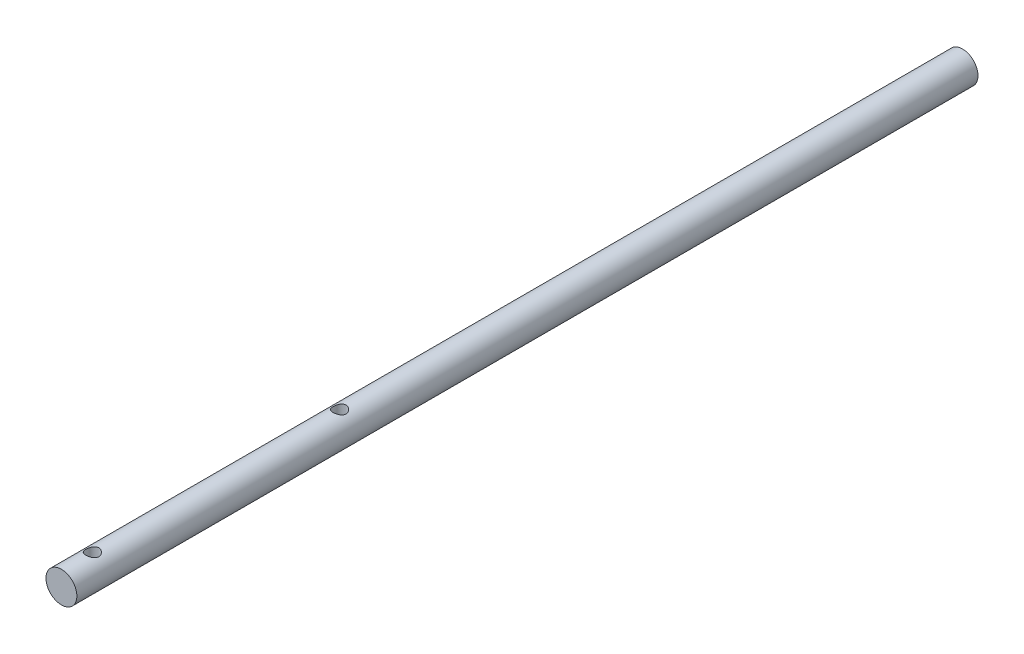
ISO-10303-21;
HEADER;
FILE_DESCRIPTION(('STEP AP214'),'2;1');
FILE_NAME('part.step','',(''),(''),'','','');
FILE_SCHEMA(('AUTOMOTIVE_DESIGN { 1 0 10303 214 1 1 1 1 }'));
ENDSEC;
DATA;
#1=APPLICATION_CONTEXT('core data for automotive mechanical design processes');
#2=APPLICATION_PROTOCOL_DEFINITION('international standard','automotive_design',2000,#1);
#3=PRODUCT_CONTEXT('',#1,'mechanical');
#4=PRODUCT('Part','Part','',(#3));
#5=PRODUCT_RELATED_PRODUCT_CATEGORY('part','',(#4));
#6=PRODUCT_DEFINITION_FORMATION('','',#4);
#7=PRODUCT_DEFINITION_CONTEXT('part definition',#1,'design');
#8=PRODUCT_DEFINITION('design','',#6,#7);
#9=PRODUCT_DEFINITION_SHAPE('','',#8);
#10=(LENGTH_UNIT() NAMED_UNIT(*) SI_UNIT(.MILLI.,.METRE.));
#11=(NAMED_UNIT(*) PLANE_ANGLE_UNIT() SI_UNIT($,.RADIAN.));
#12=(NAMED_UNIT(*) SI_UNIT($,.STERADIAN.) SOLID_ANGLE_UNIT());
#13=UNCERTAINTY_MEASURE_WITH_UNIT(LENGTH_MEASURE(1.E-05),#10,'distance_accuracy_value','');
#14=(GEOMETRIC_REPRESENTATION_CONTEXT(3) GLOBAL_UNCERTAINTY_ASSIGNED_CONTEXT((#13)) GLOBAL_UNIT_ASSIGNED_CONTEXT((#10,
#11,#12)) REPRESENTATION_CONTEXT('',''));
#15=CARTESIAN_POINT('',(0.,0.,0.));
#16=DIRECTION('',(0.,0.,1.));
#17=DIRECTION('',(1.,0.,0.));
#18=AXIS2_PLACEMENT_3D('',#15,#16,#17);
#19=CARTESIAN_POINT('',(0.,0.,175.));
#20=DIRECTION('',(0.,0.,-1.));
#21=DIRECTION('',(-1.,0.,0.));
#22=AXIS2_PLACEMENT_3D('',#19,#20,#21);
#23=CYLINDRICAL_SURFACE('',#22,3.);
#24=CARTESIAN_POINT('',(0.,-3.,170.25));
#25=CARTESIAN_POINT('',(0.0669580526362678,-2.99999458367273,170.249992794909));
#26=CARTESIAN_POINT('',(0.134021397063843,-2.9977323297471,170.244588041472));
#27=CARTESIAN_POINT('',(0.266247371156348,-2.98890153579552,170.22316093508));
#28=CARTESIAN_POINT('',(0.331404576423564,-2.98232175901028,170.207110875536));
#29=CARTESIAN_POINT('',(0.457688733653095,-2.96556289038127,170.165088908219));
#30=CARTESIAN_POINT('',(0.518828524426284,-2.95539599975003,170.139150610532));
#31=CARTESIAN_POINT('',(0.635829756679815,-2.93245286470664,170.078227176767));
#32=CARTESIAN_POINT('',(0.691692790015943,-2.91967741092849,170.043244781029));
#33=CARTESIAN_POINT('',(0.799448403559513,-2.89207828351869,169.963371017409));
#34=CARTESIAN_POINT('',(0.851041267517777,-2.87718753326093,169.91809869121));
#35=CARTESIAN_POINT('',(0.946159821091273,-2.84732714068513,169.819735665217));
#36=CARTESIAN_POINT('',(0.989681263153091,-2.83235746106809,169.766640875105));
#37=CARTESIAN_POINT('',(1.06953737697066,-2.80321021812995,169.650973222435));
#38=CARTESIAN_POINT('',(1.10541308153926,-2.78910786873385,169.588062551573));
#39=CARTESIAN_POINT('',(1.16593940588866,-2.76435572357005,169.456426742079));
#40=CARTESIAN_POINT('',(1.19059580836291,-2.75370415000823,169.387704620516));
#41=CARTESIAN_POINT('',(1.22674598312159,-2.73778555387705,169.249846308232));
#42=CARTESIAN_POINT('',(1.23881657877606,-2.73228387651787,169.180889516608));
#43=CARTESIAN_POINT('',(1.25125209967797,-2.72661326219504,169.041726707313));
#44=CARTESIAN_POINT('',(1.25162348054398,-2.7264413842526,168.971521399974));
#45=CARTESIAN_POINT('',(1.24108450363674,-2.73125119560853,168.837599939565));
#46=CARTESIAN_POINT('',(1.23103681112301,-2.73583882723623,168.773798903436));
#47=CARTESIAN_POINT('',(1.20139191015777,-2.74898482773796,168.648887909));
#48=CARTESIAN_POINT('',(1.18179287287177,-2.75754395703563,168.587778468508));
#49=CARTESIAN_POINT('',(1.13321958727571,-2.77786184772756,168.468442297009));
#50=CARTESIAN_POINT('',(1.10405471539236,-2.78968481949136,168.410304579087));
#51=CARTESIAN_POINT('',(1.03731242580561,-2.81518331141086,168.29952226612));
#52=CARTESIAN_POINT('',(0.999731690519536,-2.8288595612978,168.246879849386));
#53=CARTESIAN_POINT('',(0.91349596554383,-2.85792976877979,168.143900041267));
#54=CARTESIAN_POINT('',(0.864173483207521,-2.87337121404473,168.094133432615));
#55=CARTESIAN_POINT('',(0.757729591051508,-2.90325673112529,168.003386497041));
#56=CARTESIAN_POINT('',(0.700606359448454,-2.9177005687701,167.962408228308));
#57=CARTESIAN_POINT('',(0.578447948693374,-2.94438283556473,167.889564176384));
#58=CARTESIAN_POINT('',(0.513260582447676,-2.95656266543334,167.857930554849));
#59=CARTESIAN_POINT('',(0.377852402526824,-2.97689481414803,167.806278860397));
#60=CARTESIAN_POINT('',(0.307634394795024,-2.985049358458,167.786254368056));
#61=CARTESIAN_POINT('',(0.168928113346216,-2.99599641186385,167.759584007873));
#62=CARTESIAN_POINT('',(0.100611285278629,-2.99909541047125,167.752172142556));
#63=CARTESIAN_POINT('',(-0.0363546554960972,-3.00056050368745,167.748653776386));
#64=CARTESIAN_POINT('',(-0.105003667152643,-2.99892795711939,167.752544029748));
#65=CARTESIAN_POINT('',(-0.23709824234144,-2.9913121765694,167.770971084806));
#66=CARTESIAN_POINT('',(-0.30063296663939,-2.9855488728399,167.784969954097));
#67=CARTESIAN_POINT('',(-0.424382748971094,-2.97048606772414,167.822468194541));
#68=CARTESIAN_POINT('',(-0.484597386518366,-2.96118611959704,167.84596876595));
#69=CARTESIAN_POINT('',(-0.602108999869142,-2.93958270645166,167.902570975712));
#70=CARTESIAN_POINT('',(-0.659257236855328,-2.92719491469281,167.935948183146));
#71=CARTESIAN_POINT('',(-0.767346216231435,-2.9007380457909,168.011053377792));
#72=CARTESIAN_POINT('',(-0.81828435260195,-2.88666826768733,168.052784851529));
#73=CARTESIAN_POINT('',(-0.916333430274275,-2.85712087895437,168.146903233272));
#74=CARTESIAN_POINT('',(-0.962910697979845,-2.84161451591029,168.199838502986));
#75=CARTESIAN_POINT('',(-1.04666984610552,-2.81184336768005,168.313021275935));
#76=CARTESIAN_POINT('',(-1.08384959285618,-2.79757886493438,168.373270435172));
#77=CARTESIAN_POINT('',(-1.148159602087,-2.77181386243988,168.500614175303));
#78=CARTESIAN_POINT('',(-1.1751391823733,-2.76035562555111,168.567794035515));
#79=CARTESIAN_POINT('',(-1.21717413951573,-2.74208355658957,168.70637059381));
#80=CARTESIAN_POINT('',(-1.23223934863688,-2.73526589555752,168.777763762483));
#81=CARTESIAN_POINT('',(-1.24904080348901,-2.72763164537264,168.916818699199));
#82=CARTESIAN_POINT('',(-1.2517138041313,-2.72639350967162,168.984344662293));
#83=CARTESIAN_POINT('',(-1.24615575523912,-2.72893853011024,169.118842861141));
#84=CARTESIAN_POINT('',(-1.23792637964721,-2.73272091540306,169.185815180314));
#85=CARTESIAN_POINT('',(-1.21158404780492,-2.74449551302268,169.314092747469));
#86=CARTESIAN_POINT('',(-1.19394903571467,-2.7522835484648,169.375516673463));
#87=CARTESIAN_POINT('',(-1.14976328202135,-2.77103181199189,169.494548021357));
#88=CARTESIAN_POINT('',(-1.12321003517252,-2.78199293131693,169.552154365399));
#89=CARTESIAN_POINT('',(-1.0601028593549,-2.80666954560013,169.665695895949));
#90=CARTESIAN_POINT('',(-1.02304360910484,-2.82051102713679,169.721322330168));
#91=CARTESIAN_POINT('',(-0.940684072630407,-2.84903689053839,169.825860139361));
#92=CARTESIAN_POINT('',(-0.895380928905638,-2.86372156345874,169.874769175601));
#93=CARTESIAN_POINT('',(-0.793902045778841,-2.89356392850106,169.968148681685));
#94=CARTESIAN_POINT('',(-0.737174739949044,-2.90867817511791,170.012036432841));
#95=CARTESIAN_POINT('',(-0.616600079253208,-2.9366014362202,170.089699453544));
#96=CARTESIAN_POINT('',(-0.552749497945751,-2.9494093991674,170.12347011489));
#97=CARTESIAN_POINT('',(-0.420732056717951,-2.97109183362461,170.17920984544));
#98=CARTESIAN_POINT('',(-0.352653990980636,-2.98002782581964,170.201364766617));
#99=CARTESIAN_POINT('',(-0.21341042184656,-2.99321009768625,170.233706329078));
#100=CARTESIAN_POINT('',(-0.14225531698096,-2.99747105811967,170.24393044253));
#101=CARTESIAN_POINT('',(-0.0472360819191856,-2.99972287568934,170.249333161086));
#102=CARTESIAN_POINT('',(-0.0236245946756582,-3.00000191102536,170.250002542149));
#103=CARTESIAN_POINT('',(0.,-3.,170.25));
#104=B_SPLINE_CURVE_WITH_KNOTS('',3,(#24,#25,#26,#27,#28,#29,#30,#31,#32,#33,#34,#35,#36,#37,
#38,#39,#40,#41,#42,#43,#44,#45,#46,#47,#48,#49,#50,#51,#52,#53,#54,#55,#56,#57,#58,#59,#60,#61,
#62,#63,#64,#65,#66,#67,#68,#69,#70,#71,#72,#73,#74,#75,#76,#77,#78,#79,#80,#81,#82,#83,#84,#85,
#86,#87,#88,#89,#90,#91,#92,#93,#94,#95,#96,#97,#98,#99,#100,#101,#102,#103),.UNSPECIFIED.,.T.,
.F.,(4,2,2,2,2,2,2,2,2,2,2,2,2,2,2,2,2,2,2,2,2,2,2,2,2,2,2,2,2,2,2,2,2,2,2,2,2,2,2,4),(0.,
0.200806918883941,0.402138540628699,0.602791851906322,0.803384436852973,1.01317936288808,
1.22308438131466,1.44331724539126,1.66343646730589,1.87295273137559,2.08235338249048,
2.27570157202556,2.46908679727212,2.66658713058717,2.86416545717208,3.07844141127898,
3.2927674931459,3.51204055060814,3.73119224218299,3.93648443393253,4.14171767493173,
4.33676589735723,4.53183876601786,4.73297135272163,4.93418805469498,5.14978488029297,
5.36543061240344,5.58414788359525,5.8026844707458,6.00439877559647,6.20608211297535,
6.39837649964764,6.59072494950612,6.79463893397442,6.99862373425941,7.21746535004888,
7.43640649428584,7.65172855819387,7.86637250469323,7.937222564991),.UNSPECIFIED.);
#105=CARTESIAN_POINT('',(0.,-3.,170.25));
#106=VERTEX_POINT('',#105);
#107=EDGE_CURVE('E10',#106,#106,#104,.T.);
#108=ORIENTED_EDGE('',*,*,#107,.T.);
#109=EDGE_LOOP('',(#108));
#110=FACE_BOUND('',#109,.T.);
#111=CARTESIAN_POINT('',(0.,3.,170.25));
#112=CARTESIAN_POINT('',(-0.0669580526362678,2.99999458367273,170.249992794909));
#113=CARTESIAN_POINT('',(-0.134021397063843,2.9977323297471,170.244588041472));
#114=CARTESIAN_POINT('',(-0.266247371156348,2.98890153579552,170.22316093508));
#115=CARTESIAN_POINT('',(-0.331404576423564,2.98232175901028,170.207110875536));
#116=CARTESIAN_POINT('',(-0.457688733653095,2.96556289038127,170.165088908219));
#117=CARTESIAN_POINT('',(-0.518828524426284,2.95539599975003,170.139150610532));
#118=CARTESIAN_POINT('',(-0.635829756679816,2.93245286470664,170.078227176767));
#119=CARTESIAN_POINT('',(-0.691692790015945,2.91967741092849,170.043244781029));
#120=CARTESIAN_POINT('',(-0.799448403559509,2.89207828351869,169.963371017409));
#121=CARTESIAN_POINT('',(-0.851041267517766,2.87718753326093,169.91809869121));
#122=CARTESIAN_POINT('',(-0.946159821091262,2.84732714068514,169.819735665217));
#123=CARTESIAN_POINT('',(-0.989681263153088,2.83235746106809,169.766640875105));
#124=CARTESIAN_POINT('',(-1.06953737697066,2.80321021812995,169.650973222435));
#125=CARTESIAN_POINT('',(-1.10541308153926,2.78910786873384,169.588062551573));
#126=CARTESIAN_POINT('',(-1.16593940588866,2.76435572357005,169.456426742079));
#127=CARTESIAN_POINT('',(-1.19059580836291,2.75370415000823,169.387704620516));
#128=CARTESIAN_POINT('',(-1.22674598312159,2.73778555387705,169.249846308232));
#129=CARTESIAN_POINT('',(-1.23881657877606,2.73228387651787,169.180889516608));
#130=CARTESIAN_POINT('',(-1.25125209967797,2.72661326219504,169.041726707313));
#131=CARTESIAN_POINT('',(-1.25162348054398,2.7264413842526,168.971521399974));
#132=CARTESIAN_POINT('',(-1.24108450363674,2.73125119560853,168.837599939565));
#133=CARTESIAN_POINT('',(-1.23103681112301,2.73583882723623,168.773798903436));
#134=CARTESIAN_POINT('',(-1.20139191015777,2.74898482773796,168.648887909));
#135=CARTESIAN_POINT('',(-1.18179287287177,2.75754395703563,168.587778468508));
#136=CARTESIAN_POINT('',(-1.13321958727571,2.77786184772756,168.468442297009));
#137=CARTESIAN_POINT('',(-1.10405471539236,2.78968481949136,168.410304579087));
#138=CARTESIAN_POINT('',(-1.03731242580561,2.81518331141086,168.29952226612));
#139=CARTESIAN_POINT('',(-0.999731690519536,2.8288595612978,168.246879849386));
#140=CARTESIAN_POINT('',(-0.91349596554383,2.85792976877979,168.143900041267));
#141=CARTESIAN_POINT('',(-0.864173483207521,2.87337121404473,168.094133432615));
#142=CARTESIAN_POINT('',(-0.757729591051508,2.90325673112529,168.003386497041));
#143=CARTESIAN_POINT('',(-0.700606359448454,2.9177005687701,167.962408228308));
#144=CARTESIAN_POINT('',(-0.578447948693374,2.94438283556473,167.889564176384));
#145=CARTESIAN_POINT('',(-0.513260582447676,2.95656266543334,167.857930554849));
#146=CARTESIAN_POINT('',(-0.377852402526824,2.97689481414803,167.806278860397));
#147=CARTESIAN_POINT('',(-0.307634394795024,2.985049358458,167.786254368056));
#148=CARTESIAN_POINT('',(-0.168928113346216,2.99599641186385,167.759584007873));
#149=CARTESIAN_POINT('',(-0.100611285278629,2.99909541047125,167.752172142556));
#150=CARTESIAN_POINT('',(0.0363546554960975,3.00056050368745,167.748653776386));
#151=CARTESIAN_POINT('',(0.105003667152643,2.99892795711939,167.752544029748));
#152=CARTESIAN_POINT('',(0.237098242341441,2.9913121765694,167.770971084806));
#153=CARTESIAN_POINT('',(0.30063296663939,2.9855488728399,167.784969954097));
#154=CARTESIAN_POINT('',(0.424382748971094,2.97048606772414,167.822468194541));
#155=CARTESIAN_POINT('',(0.484597386518366,2.96118611959704,167.84596876595));
#156=CARTESIAN_POINT('',(0.602108999869142,2.93958270645166,167.902570975712));
#157=CARTESIAN_POINT('',(0.659257236855328,2.92719491469281,167.935948183146));
#158=CARTESIAN_POINT('',(0.767346216231435,2.9007380457909,168.011053377792));
#159=CARTESIAN_POINT('',(0.81828435260195,2.88666826768733,168.052784851529));
#160=CARTESIAN_POINT('',(0.916333430274275,2.85712087895437,168.146903233272));
#161=CARTESIAN_POINT('',(0.962910697979845,2.84161451591029,168.199838502986));
#162=CARTESIAN_POINT('',(1.04666984610552,2.81184336768005,168.313021275935));
#163=CARTESIAN_POINT('',(1.08384959285618,2.79757886493438,168.373270435172));
#164=CARTESIAN_POINT('',(1.148159602087,2.77181386243988,168.500614175303));
#165=CARTESIAN_POINT('',(1.1751391823733,2.76035562555111,168.567794035515));
#166=CARTESIAN_POINT('',(1.21717413951573,2.74208355658957,168.70637059381));
#167=CARTESIAN_POINT('',(1.23223934863688,2.73526589555752,168.777763762483));
#168=CARTESIAN_POINT('',(1.24904080348901,2.72763164537264,168.916818699199));
#169=CARTESIAN_POINT('',(1.2517138041313,2.72639350967162,168.984344662293));
#170=CARTESIAN_POINT('',(1.24615575523912,2.72893853011024,169.118842861141));
#171=CARTESIAN_POINT('',(1.23792637964721,2.73272091540306,169.185815180314));
#172=CARTESIAN_POINT('',(1.21158404780492,2.74449551302268,169.314092747469));
#173=CARTESIAN_POINT('',(1.19394903571467,2.7522835484648,169.375516673463));
#174=CARTESIAN_POINT('',(1.14976328202135,2.77103181199189,169.494548021357));
#175=CARTESIAN_POINT('',(1.12321003517252,2.78199293131693,169.552154365399));
#176=CARTESIAN_POINT('',(1.0601028593549,2.80666954560013,169.665695895949));
#177=CARTESIAN_POINT('',(1.02304360910484,2.82051102713679,169.721322330168));
#178=CARTESIAN_POINT('',(0.940684072630407,2.84903689053839,169.825860139361));
#179=CARTESIAN_POINT('',(0.895380928905638,2.86372156345874,169.874769175601));
#180=CARTESIAN_POINT('',(0.793902045778841,2.89356392850106,169.968148681685));
#181=CARTESIAN_POINT('',(0.737174739949044,2.90867817511791,170.012036432841));
#182=CARTESIAN_POINT('',(0.616600079253208,2.9366014362202,170.089699453544));
#183=CARTESIAN_POINT('',(0.552749497945751,2.9494093991674,170.12347011489));
#184=CARTESIAN_POINT('',(0.420732056717951,2.97109183362461,170.17920984544));
#185=CARTESIAN_POINT('',(0.352653990980636,2.98002782581964,170.201364766617));
#186=CARTESIAN_POINT('',(0.21341042184656,2.99321009768625,170.233706329078));
#187=CARTESIAN_POINT('',(0.14225531698096,2.99747105811967,170.24393044253));
#188=CARTESIAN_POINT('',(0.0472360819191856,2.99972287568934,170.249333161086));
#189=CARTESIAN_POINT('',(0.0236245946756582,3.00000191102536,170.250002542149));
#190=CARTESIAN_POINT('',(0.,3.,170.25));
#191=B_SPLINE_CURVE_WITH_KNOTS('',3,(#111,#112,#113,#114,#115,#116,#117,#118,#119,#120,#121,
#122,#123,#124,#125,#126,#127,#128,#129,#130,#131,#132,#133,#134,#135,#136,#137,#138,#139,#140,
#141,#142,#143,#144,#145,#146,#147,#148,#149,#150,#151,#152,#153,#154,#155,#156,#157,#158,#159,
#160,#161,#162,#163,#164,#165,#166,#167,#168,#169,#170,#171,#172,#173,#174,#175,#176,#177,#178,
#179,#180,#181,#182,#183,#184,#185,#186,#187,#188,#189,#190),.UNSPECIFIED.,.T.,.F.,(4,2,2,2,2,2,
2,2,2,2,2,2,2,2,2,2,2,2,2,2,2,2,2,2,2,2,2,2,2,2,2,2,2,2,2,2,2,2,2,4),(0.,0.200806918883941,
0.402138540628699,0.602791851906322,0.803384436852973,1.01317936288807,1.22308438131465,
1.44331724539126,1.66343646730588,1.87295273137559,2.08235338249048,2.27570157202556,
2.46908679727212,2.66658713058717,2.86416545717208,3.07844141127897,3.29276749314589,
3.51204055060814,3.73119224218299,3.93648443393252,4.14171767493173,4.33676589735723,
4.53183876601786,4.73297135272162,4.93418805469498,5.14978488029297,5.36543061240344,
5.58414788359525,5.8026844707458,6.00439877559647,6.20608211297535,6.39837649964764,
6.59072494950612,6.79463893397442,6.99862373425941,7.21746535004888,7.43640649428584,
7.65172855819387,7.86637250469323,7.937222564991),.UNSPECIFIED.);
#192=CARTESIAN_POINT('',(0.,3.,170.25));
#193=VERTEX_POINT('',#192);
#194=EDGE_CURVE('E41',#193,#193,#191,.T.);
#195=ORIENTED_EDGE('',*,*,#194,.T.);
#196=EDGE_LOOP('',(#195));
#197=FACE_BOUND('',#196,.T.);
#198=CARTESIAN_POINT('',(0.,-3.,122.25));
#199=CARTESIAN_POINT('',(0.066958052636267,-2.99999458367273,122.249992794909));
#200=CARTESIAN_POINT('',(0.134021397063841,-2.9977323297471,122.244588041472));
#201=CARTESIAN_POINT('',(0.266247371156347,-2.98890153579552,122.22316093508));
#202=CARTESIAN_POINT('',(0.331404576423564,-2.98232175901028,122.207110875536));
#203=CARTESIAN_POINT('',(0.457688733653091,-2.96556289038127,122.165088908219));
#204=CARTESIAN_POINT('',(0.518828524426274,-2.95539599975004,122.139150610532));
#205=CARTESIAN_POINT('',(0.635829756679807,-2.93245286470664,122.078227176767));
#206=CARTESIAN_POINT('',(0.691692790015941,-2.91967741092849,122.043244781029));
#207=CARTESIAN_POINT('',(0.799448403559513,-2.89207828351869,121.963371017409));
#208=CARTESIAN_POINT('',(0.851041267517772,-2.87718753326093,121.91809869121));
#209=CARTESIAN_POINT('',(0.946159821091265,-2.84732714068513,121.819735665217));
#210=CARTESIAN_POINT('',(0.989681263153087,-2.83235746106809,121.766640875105));
#211=CARTESIAN_POINT('',(1.06953737697065,-2.80321021812995,121.650973222435));
#212=CARTESIAN_POINT('',(1.10541308153925,-2.78910786873385,121.588062551573));
#213=CARTESIAN_POINT('',(1.16593940588866,-2.76435572357005,121.456426742079));
#214=CARTESIAN_POINT('',(1.19059580836291,-2.75370415000823,121.387704620516));
#215=CARTESIAN_POINT('',(1.22674598312159,-2.73778555387705,121.249846308232));
#216=CARTESIAN_POINT('',(1.23881657877606,-2.73228387651787,121.180889516608));
#217=CARTESIAN_POINT('',(1.25125209967797,-2.72661326219504,121.041726707313));
#218=CARTESIAN_POINT('',(1.25162348054398,-2.7264413842526,120.971521399974));
#219=CARTESIAN_POINT('',(1.24108450363674,-2.73125119560853,120.837599939565));
#220=CARTESIAN_POINT('',(1.23103681112301,-2.73583882723623,120.773798903436));
#221=CARTESIAN_POINT('',(1.20139191015777,-2.74898482773796,120.648887909));
#222=CARTESIAN_POINT('',(1.18179287287177,-2.75754395703564,120.587778468508));
#223=CARTESIAN_POINT('',(1.13321958727571,-2.77786184772756,120.468442297009));
#224=CARTESIAN_POINT('',(1.10405471539236,-2.78968481949136,120.410304579087));
#225=CARTESIAN_POINT('',(1.03731242580563,-2.81518331141086,120.29952226612));
#226=CARTESIAN_POINT('',(0.999731690519549,-2.82885956129779,120.246879849386));
#227=CARTESIAN_POINT('',(0.913495965543841,-2.85792976877979,120.143900041267));
#228=CARTESIAN_POINT('',(0.864173483207533,-2.87337121404473,120.094133432615));
#229=CARTESIAN_POINT('',(0.75772959105152,-2.90325673112529,120.003386497041));
#230=CARTESIAN_POINT('',(0.700606359448464,-2.9177005687701,119.962408228308));
#231=CARTESIAN_POINT('',(0.578447948693381,-2.94438283556473,119.889564176384));
#232=CARTESIAN_POINT('',(0.513260582447683,-2.95656266543334,119.857930554849));
#233=CARTESIAN_POINT('',(0.377852402526833,-2.97689481414803,119.806278860397));
#234=CARTESIAN_POINT('',(0.307634394795035,-2.985049358458,119.786254368056));
#235=CARTESIAN_POINT('',(0.168928113346227,-2.99599641186385,119.759584007873));
#236=CARTESIAN_POINT('',(0.100611285278638,-2.99909541047125,119.752172142556));
#237=CARTESIAN_POINT('',(-0.0363546554960902,-3.00056050368745,119.748653776386));
#238=CARTESIAN_POINT('',(-0.105003667152637,-2.99892795711939,119.752544029748));
#239=CARTESIAN_POINT('',(-0.237098242341436,-2.9913121765694,119.770971084806));
#240=CARTESIAN_POINT('',(-0.300632966639387,-2.9855488728399,119.784969954097));
#241=CARTESIAN_POINT('',(-0.424382748971092,-2.97048606772414,119.822468194541));
#242=CARTESIAN_POINT('',(-0.484597386518362,-2.96118611959704,119.84596876595));
#243=CARTESIAN_POINT('',(-0.60210899986914,-2.93958270645166,119.902570975712));
#244=CARTESIAN_POINT('',(-0.659257236855328,-2.92719491469281,119.935948183146));
#245=CARTESIAN_POINT('',(-0.767346216231434,-2.9007380457909,120.011053377792));
#246=CARTESIAN_POINT('',(-0.818284352601945,-2.88666826768733,120.052784851529));
#247=CARTESIAN_POINT('',(-0.916333430274267,-2.85712087895437,120.146903233272));
#248=CARTESIAN_POINT('',(-0.962910697979837,-2.84161451591029,120.199838502986));
#249=CARTESIAN_POINT('',(-1.04666984610551,-2.81184336768005,120.313021275935));
#250=CARTESIAN_POINT('',(-1.08384959285618,-2.79757886493438,120.373270435172));
#251=CARTESIAN_POINT('',(-1.148159602087,-2.77181386243988,120.500614175303));
#252=CARTESIAN_POINT('',(-1.17513918237329,-2.76035562555111,120.567794035515));
#253=CARTESIAN_POINT('',(-1.21717413951573,-2.74208355658957,120.70637059381));
#254=CARTESIAN_POINT('',(-1.23223934863688,-2.73526589555752,120.777763762483));
#255=CARTESIAN_POINT('',(-1.24904080348901,-2.72763164537264,120.916818699199));
#256=CARTESIAN_POINT('',(-1.25171380413129,-2.72639350967163,120.984344662293));
#257=CARTESIAN_POINT('',(-1.24615575523912,-2.72893853011024,121.118842861141));
#258=CARTESIAN_POINT('',(-1.23792637964722,-2.73272091540306,121.185815180314));
#259=CARTESIAN_POINT('',(-1.21158404780491,-2.74449551302268,121.314092747469));
#260=CARTESIAN_POINT('',(-1.19394903571466,-2.7522835484648,121.375516673463));
#261=CARTESIAN_POINT('',(-1.14976328202135,-2.77103181199189,121.494548021357));
#262=CARTESIAN_POINT('',(-1.12321003517252,-2.78199293131693,121.552154365399));
#263=CARTESIAN_POINT('',(-1.06010285935489,-2.80666954560013,121.665695895949));
#264=CARTESIAN_POINT('',(-1.02304360910483,-2.82051102713679,121.721322330168));
#265=CARTESIAN_POINT('',(-0.940684072630394,-2.84903689053839,121.825860139361));
#266=CARTESIAN_POINT('',(-0.895380928905621,-2.86372156345875,121.874769175601));
#267=CARTESIAN_POINT('',(-0.793902045778822,-2.89356392850106,121.968148681685));
#268=CARTESIAN_POINT('',(-0.737174739949028,-2.90867817511792,122.012036432841));
#269=CARTESIAN_POINT('',(-0.6166000792532,-2.9366014362202,122.089699453544));
#270=CARTESIAN_POINT('',(-0.552749497945749,-2.9494093991674,122.12347011489));
#271=CARTESIAN_POINT('',(-0.420732056717953,-2.97109183362461,122.17920984544));
#272=CARTESIAN_POINT('',(-0.352653990980636,-2.98002782581964,122.201364766617));
#273=CARTESIAN_POINT('',(-0.213410421846558,-2.99321009768625,122.233706329078));
#274=CARTESIAN_POINT('',(-0.142255316980958,-2.99747105811967,122.24393044253));
#275=CARTESIAN_POINT('',(-0.0472360819191837,-2.99972287568934,122.249333161086));
#276=CARTESIAN_POINT('',(-0.0236245946756572,-3.00000191102536,122.250002542149));
#277=CARTESIAN_POINT('',(0.,-3.,122.25));
#278=B_SPLINE_CURVE_WITH_KNOTS('',3,(#198,#199,#200,#201,#202,#203,#204,#205,#206,#207,#208,
#209,#210,#211,#212,#213,#214,#215,#216,#217,#218,#219,#220,#221,#222,#223,#224,#225,#226,#227,
#228,#229,#230,#231,#232,#233,#234,#235,#236,#237,#238,#239,#240,#241,#242,#243,#244,#245,#246,
#247,#248,#249,#250,#251,#252,#253,#254,#255,#256,#257,#258,#259,#260,#261,#262,#263,#264,#265,
#266,#267,#268,#269,#270,#271,#272,#273,#274,#275,#276,#277),.UNSPECIFIED.,.T.,.F.,(4,2,2,2,2,2,
2,2,2,2,2,2,2,2,2,2,2,2,2,2,2,2,2,2,2,2,2,2,2,2,2,2,2,2,2,2,2,2,2,4),(0.,0.200806918883939,
0.402138540628695,0.602791851906305,0.803384436852979,1.01317936288807,1.22308438131466,
1.44331724539125,1.66343646730587,1.87295273137556,2.08235338249047,2.27570157202557,
2.46908679727214,2.66658713058714,2.86416545717206,3.07844141127896,3.29276749314588,
3.51204055060814,3.73119224218298,3.93648443393252,4.14171767493172,4.33676589735722,
4.53183876601786,4.73297135272163,4.93418805469496,5.14978488029294,5.36543061240342,
5.58414788359526,5.8026844707458,6.00439877559644,6.20608211297538,6.39837649964763,
6.59072494950614,6.79463893397442,6.99862373425945,7.2174653500489,7.43640649428583,
7.65172855819387,7.86637250469323,7.93722256499099),.UNSPECIFIED.);
#279=CARTESIAN_POINT('',(0.,-3.,122.25));
#280=VERTEX_POINT('',#279);
#281=EDGE_CURVE('E45',#280,#280,#278,.T.);
#282=ORIENTED_EDGE('',*,*,#281,.T.);
#283=EDGE_LOOP('',(#282));
#284=FACE_BOUND('',#283,.T.);
#285=CARTESIAN_POINT('',(0.,3.,122.25));
#286=CARTESIAN_POINT('',(-0.0669580526362671,2.99999458367273,122.249992794909));
#287=CARTESIAN_POINT('',(-0.134021397063841,2.9977323297471,122.244588041472));
#288=CARTESIAN_POINT('',(-0.266247371156347,2.98890153579552,122.22316093508));
#289=CARTESIAN_POINT('',(-0.331404576423564,2.98232175901028,122.207110875536));
#290=CARTESIAN_POINT('',(-0.457688733653091,2.96556289038127,122.165088908219));
#291=CARTESIAN_POINT('',(-0.518828524426274,2.95539599975004,122.139150610532));
#292=CARTESIAN_POINT('',(-0.635829756679807,2.93245286470664,122.078227176767));
#293=CARTESIAN_POINT('',(-0.691692790015942,2.91967741092849,122.043244781029));
#294=CARTESIAN_POINT('',(-0.799448403559513,2.89207828351869,121.963371017409));
#295=CARTESIAN_POINT('',(-0.851041267517772,2.87718753326093,121.91809869121));
#296=CARTESIAN_POINT('',(-0.946159821091265,2.84732714068513,121.819735665217));
#297=CARTESIAN_POINT('',(-0.989681263153086,2.83235746106809,121.766640875105));
#298=CARTESIAN_POINT('',(-1.06953737697065,2.80321021812995,121.650973222435));
#299=CARTESIAN_POINT('',(-1.10541308153925,2.78910786873385,121.588062551573));
#300=CARTESIAN_POINT('',(-1.16593940588866,2.76435572357005,121.456426742079));
#301=CARTESIAN_POINT('',(-1.19059580836291,2.75370415000823,121.387704620516));
#302=CARTESIAN_POINT('',(-1.22674598312159,2.73778555387705,121.249846308232));
#303=CARTESIAN_POINT('',(-1.23881657877606,2.73228387651787,121.180889516608));
#304=CARTESIAN_POINT('',(-1.25125209967797,2.72661326219504,121.041726707313));
#305=CARTESIAN_POINT('',(-1.25162348054398,2.7264413842526,120.971521399974));
#306=CARTESIAN_POINT('',(-1.24108450363674,2.73125119560853,120.837599939565));
#307=CARTESIAN_POINT('',(-1.23103681112301,2.73583882723623,120.773798903436));
#308=CARTESIAN_POINT('',(-1.20139191015777,2.74898482773796,120.648887909));
#309=CARTESIAN_POINT('',(-1.18179287287177,2.75754395703564,120.587778468508));
#310=CARTESIAN_POINT('',(-1.13321958727571,2.77786184772756,120.468442297009));
#311=CARTESIAN_POINT('',(-1.10405471539236,2.78968481949136,120.410304579087));
#312=CARTESIAN_POINT('',(-1.03731242580563,2.81518331141086,120.29952226612));
#313=CARTESIAN_POINT('',(-0.999731690519549,2.82885956129779,120.246879849386));
#314=CARTESIAN_POINT('',(-0.913495965543837,2.85792976877979,120.143900041267));
#315=CARTESIAN_POINT('',(-0.864173483207525,2.87337121404473,120.094133432615));
#316=CARTESIAN_POINT('',(-0.757729591051511,2.90325673112529,120.003386497041));
#317=CARTESIAN_POINT('',(-0.700606359448459,2.9177005687701,119.962408228308));
#318=CARTESIAN_POINT('',(-0.578447948693381,2.94438283556473,119.889564176384));
#319=CARTESIAN_POINT('',(-0.513260582447683,2.95656266543334,119.857930554849));
#320=CARTESIAN_POINT('',(-0.377852402526833,2.97689481414803,119.806278860397));
#321=CARTESIAN_POINT('',(-0.307634394795035,2.985049358458,119.786254368056));
#322=CARTESIAN_POINT('',(-0.168928113346228,2.99599641186385,119.759584007873));
#323=CARTESIAN_POINT('',(-0.100611285278639,2.99909541047125,119.752172142556));
#324=CARTESIAN_POINT('',(0.0363546554960894,3.00056050368745,119.748653776386));
#325=CARTESIAN_POINT('',(0.105003667152636,2.99892795711939,119.752544029748));
#326=CARTESIAN_POINT('',(0.237098242341436,2.9913121765694,119.770971084806));
#327=CARTESIAN_POINT('',(0.300632966639387,2.9855488728399,119.784969954097));
#328=CARTESIAN_POINT('',(0.424382748971092,2.97048606772414,119.822468194541));
#329=CARTESIAN_POINT('',(0.484597386518362,2.96118611959704,119.84596876595));
#330=CARTESIAN_POINT('',(0.60210899986914,2.93958270645166,119.902570975712));
#331=CARTESIAN_POINT('',(0.659257236855328,2.92719491469281,119.935948183146));
#332=CARTESIAN_POINT('',(0.767346216231434,2.9007380457909,120.011053377792));
#333=CARTESIAN_POINT('',(0.818284352601945,2.88666826768733,120.052784851529));
#334=CARTESIAN_POINT('',(0.916333430274267,2.85712087895437,120.146903233272));
#335=CARTESIAN_POINT('',(0.962910697979837,2.84161451591029,120.199838502986));
#336=CARTESIAN_POINT('',(1.04666984610551,2.81184336768005,120.313021275935));
#337=CARTESIAN_POINT('',(1.08384959285618,2.79757886493438,120.373270435172));
#338=CARTESIAN_POINT('',(1.148159602087,2.77181386243988,120.500614175303));
#339=CARTESIAN_POINT('',(1.17513918237329,2.76035562555111,120.567794035515));
#340=CARTESIAN_POINT('',(1.21717413951573,2.74208355658957,120.70637059381));
#341=CARTESIAN_POINT('',(1.23223934863688,2.73526589555752,120.777763762483));
#342=CARTESIAN_POINT('',(1.24904080348901,2.72763164537264,120.916818699199));
#343=CARTESIAN_POINT('',(1.25171380413129,2.72639350967163,120.984344662293));
#344=CARTESIAN_POINT('',(1.24615575523912,2.72893853011024,121.118842861141));
#345=CARTESIAN_POINT('',(1.23792637964722,2.73272091540306,121.185815180314));
#346=CARTESIAN_POINT('',(1.21158404780491,2.74449551302268,121.314092747469));
#347=CARTESIAN_POINT('',(1.19394903571466,2.7522835484648,121.375516673463));
#348=CARTESIAN_POINT('',(1.14976328202135,2.77103181199189,121.494548021357));
#349=CARTESIAN_POINT('',(1.12321003517252,2.78199293131693,121.552154365399));
#350=CARTESIAN_POINT('',(1.06010285935489,2.80666954560013,121.665695895949));
#351=CARTESIAN_POINT('',(1.02304360910483,2.82051102713679,121.721322330168));
#352=CARTESIAN_POINT('',(0.940684072630394,2.84903689053839,121.825860139361));
#353=CARTESIAN_POINT('',(0.895380928905621,2.86372156345875,121.874769175601));
#354=CARTESIAN_POINT('',(0.793902045778822,2.89356392850106,121.968148681685));
#355=CARTESIAN_POINT('',(0.737174739949028,2.90867817511792,122.012036432841));
#356=CARTESIAN_POINT('',(0.6166000792532,2.9366014362202,122.089699453544));
#357=CARTESIAN_POINT('',(0.552749497945749,2.9494093991674,122.12347011489));
#358=CARTESIAN_POINT('',(0.420732056717953,2.97109183362461,122.17920984544));
#359=CARTESIAN_POINT('',(0.352653990980636,2.98002782581964,122.201364766617));
#360=CARTESIAN_POINT('',(0.213410421846558,2.99321009768625,122.233706329078));
#361=CARTESIAN_POINT('',(0.142255316980958,2.99747105811967,122.24393044253));
#362=CARTESIAN_POINT('',(0.0472360819191837,2.99972287568934,122.249333161086));
#363=CARTESIAN_POINT('',(0.0236245946756573,3.00000191102536,122.250002542149));
#364=CARTESIAN_POINT('',(0.,3.,122.25));
#365=B_SPLINE_CURVE_WITH_KNOTS('',3,(#285,#286,#287,#288,#289,#290,#291,#292,#293,#294,#295,
#296,#297,#298,#299,#300,#301,#302,#303,#304,#305,#306,#307,#308,#309,#310,#311,#312,#313,#314,
#315,#316,#317,#318,#319,#320,#321,#322,#323,#324,#325,#326,#327,#328,#329,#330,#331,#332,#333,
#334,#335,#336,#337,#338,#339,#340,#341,#342,#343,#344,#345,#346,#347,#348,#349,#350,#351,#352,
#353,#354,#355,#356,#357,#358,#359,#360,#361,#362,#363,#364),.UNSPECIFIED.,.T.,.F.,(4,2,2,2,2,2,
2,2,2,2,2,2,2,2,2,2,2,2,2,2,2,2,2,2,2,2,2,2,2,2,2,2,2,2,2,2,2,2,2,4),(0.,0.200806918883939,
0.402138540628695,0.602791851906305,0.803384436852979,1.01317936288807,1.22308438131466,
1.44331724539125,1.66343646730587,1.87295273137556,2.08235338249047,2.27570157202557,
2.46908679727214,2.66658713058714,2.86416545717206,3.07844141127898,3.29276749314588,
3.51204055060814,3.73119224218298,3.93648443393252,4.14171767493173,4.33676589735722,
4.53183876601786,4.73297135272163,4.93418805469496,5.14978488029295,5.36543061240342,
5.58414788359526,5.8026844707458,6.00439877559645,6.20608211297538,6.39837649964763,
6.59072494950614,6.79463893397442,6.99862373425945,7.2174653500489,7.43640649428584,
7.65172855819387,7.86637250469323,7.937222564991),.UNSPECIFIED.);
#366=CARTESIAN_POINT('',(0.,3.,122.25));
#367=VERTEX_POINT('',#366);
#368=EDGE_CURVE('E49',#367,#367,#365,.T.);
#369=ORIENTED_EDGE('',*,*,#368,.T.);
#370=EDGE_LOOP('',(#369));
#371=FACE_BOUND('',#370,.T.);
#372=CARTESIAN_POINT('',(0.,0.,175.));
#373=DIRECTION('',(0.,0.,1.));
#374=DIRECTION('',(1.,0.,0.));
#375=AXIS2_PLACEMENT_3D('',#372,#373,#374);
#376=CIRCLE('',#375,3.);
#377=CARTESIAN_POINT('',(3.,0.,175.));
#378=VERTEX_POINT('',#377);
#379=EDGE_CURVE('E74',#378,#378,#376,.T.);
#380=ORIENTED_EDGE('',*,*,#379,.F.);
#381=EDGE_LOOP('',(#380));
#382=FACE_BOUND('',#381,.T.);
#383=CARTESIAN_POINT('',(0.,0.,0.));
#384=DIRECTION('',(0.,0.,1.));
#385=DIRECTION('',(1.,0.,0.));
#386=AXIS2_PLACEMENT_3D('',#383,#384,#385);
#387=CIRCLE('',#386,3.);
#388=CARTESIAN_POINT('',(3.,0.,0.));
#389=VERTEX_POINT('',#388);
#390=EDGE_CURVE('E75',#389,#389,#387,.T.);
#391=ORIENTED_EDGE('',*,*,#390,.T.);
#392=EDGE_LOOP('',(#391));
#393=FACE_BOUND('',#392,.T.);
#394=ADVANCED_FACE('F31',(#110,#197,#284,#371,#382,#393),#23,.T.);
#395=CARTESIAN_POINT('',(0.,0.,175.));
#396=DIRECTION('',(0.,0.,1.));
#397=DIRECTION('',(1.,0.,0.));
#398=AXIS2_PLACEMENT_3D('',#395,#396,#397);
#399=PLANE('',#398);
#400=ORIENTED_EDGE('',*,*,#379,.T.);
#401=EDGE_LOOP('',(#400));
#402=FACE_BOUND('',#401,.T.);
#403=ADVANCED_FACE('F68',(#402),#399,.T.);
#404=CARTESIAN_POINT('',(0.,0.,0.));
#405=DIRECTION('',(0.,0.,1.));
#406=DIRECTION('',(1.,0.,0.));
#407=AXIS2_PLACEMENT_3D('',#404,#405,#406);
#408=PLANE('',#407);
#409=ORIENTED_EDGE('',*,*,#390,.F.);
#410=EDGE_LOOP('',(#409));
#411=FACE_BOUND('',#410,.T.);
#412=ADVANCED_FACE('F66',(#411),#408,.F.);
#413=CARTESIAN_POINT('',(0.,-3.,121.));
#414=DIRECTION('',(0.,1.,0.));
#415=DIRECTION('',(0.,0.,1.));
#416=AXIS2_PLACEMENT_3D('',#413,#414,#415);
#417=CYLINDRICAL_SURFACE('',#416,1.25);
#418=ORIENTED_EDGE('',*,*,#368,.F.);
#419=EDGE_LOOP('',(#418));
#420=FACE_BOUND('',#419,.T.);
#421=ORIENTED_EDGE('',*,*,#281,.F.);
#422=EDGE_LOOP('',(#421));
#423=FACE_BOUND('',#422,.T.);
#424=ADVANCED_FACE('F60',(#420,#423),#417,.F.);
#425=CARTESIAN_POINT('',(0.,-3.,169.));
#426=DIRECTION('',(0.,1.,0.));
#427=DIRECTION('',(0.,0.,1.));
#428=AXIS2_PLACEMENT_3D('',#425,#426,#427);
#429=CYLINDRICAL_SURFACE('',#428,1.25);
#430=ORIENTED_EDGE('',*,*,#194,.F.);
#431=EDGE_LOOP('',(#430));
#432=FACE_BOUND('',#431,.T.);
#433=ORIENTED_EDGE('',*,*,#107,.F.);
#434=EDGE_LOOP('',(#433));
#435=FACE_BOUND('',#434,.T.);
#436=ADVANCED_FACE('F57',(#432,#435),#429,.F.);
#437=CLOSED_SHELL('',(#394,#403,#412,#424,#436));
#438=MANIFOLD_SOLID_BREP('B2',#437);
#439=ADVANCED_BREP_SHAPE_REPRESENTATION('',(#18,#438),#14);
#440=SHAPE_DEFINITION_REPRESENTATION(#9,#439);
ENDSEC;
END-ISO-10303-21;
